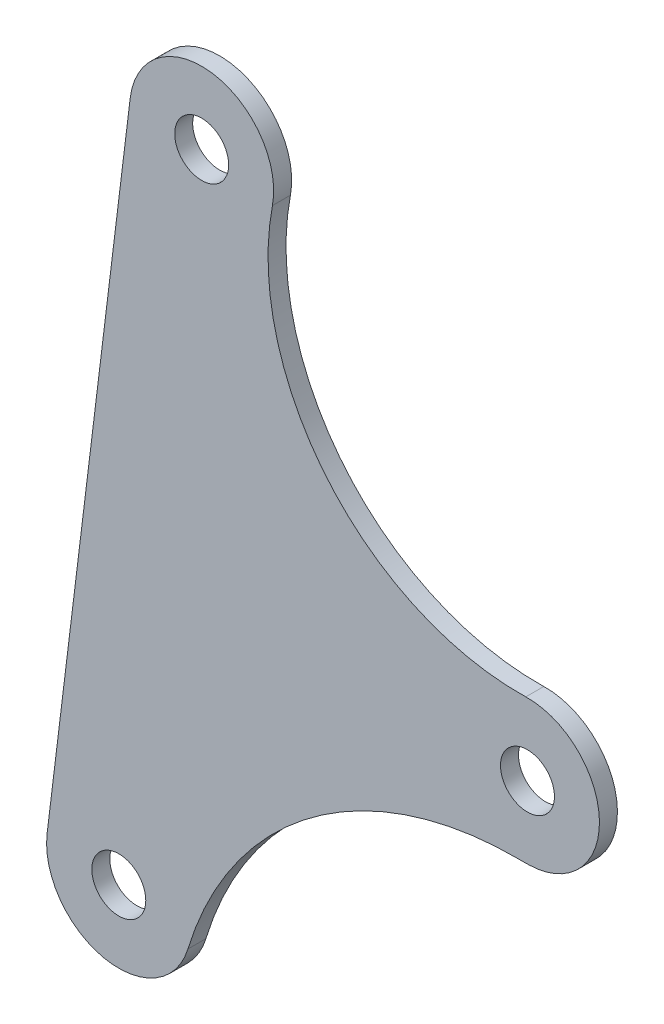
ISO-10303-21;
HEADER;
FILE_DESCRIPTION(('STEP AP214'),'2;1');
FILE_NAME('part.step','',(''),(''),'','','');
FILE_SCHEMA(('AUTOMOTIVE_DESIGN { 1 0 10303 214 1 1 1 1 }'));
ENDSEC;
DATA;
#1=APPLICATION_CONTEXT('core data for automotive mechanical design processes');
#2=APPLICATION_PROTOCOL_DEFINITION('international standard','automotive_design',2000,#1);
#3=PRODUCT_CONTEXT('',#1,'mechanical');
#4=PRODUCT('Part','Part','',(#3));
#5=PRODUCT_RELATED_PRODUCT_CATEGORY('part','',(#4));
#6=PRODUCT_DEFINITION_FORMATION('','',#4);
#7=PRODUCT_DEFINITION_CONTEXT('part definition',#1,'design');
#8=PRODUCT_DEFINITION('design','',#6,#7);
#9=PRODUCT_DEFINITION_SHAPE('','',#8);
#10=(LENGTH_UNIT() NAMED_UNIT(*) SI_UNIT(.MILLI.,.METRE.));
#11=(NAMED_UNIT(*) PLANE_ANGLE_UNIT() SI_UNIT($,.RADIAN.));
#12=(NAMED_UNIT(*) SI_UNIT($,.STERADIAN.) SOLID_ANGLE_UNIT());
#13=UNCERTAINTY_MEASURE_WITH_UNIT(LENGTH_MEASURE(1.E-05),#10,'distance_accuracy_value','');
#14=(GEOMETRIC_REPRESENTATION_CONTEXT(3) GLOBAL_UNCERTAINTY_ASSIGNED_CONTEXT((#13)) GLOBAL_UNIT_ASSIGNED_CONTEXT((#10,
#11,#12)) REPRESENTATION_CONTEXT('',''));
#15=CARTESIAN_POINT('',(0.,0.,0.));
#16=DIRECTION('',(0.,0.,1.));
#17=DIRECTION('',(1.,0.,0.));
#18=AXIS2_PLACEMENT_3D('',#15,#16,#17);
#19=CARTESIAN_POINT('',(-54.484155585902,-22.2361374727643,1.));
#20=DIRECTION('',(0.,0.,1.));
#21=DIRECTION('',(1.,0.,0.));
#22=AXIS2_PLACEMENT_3D('',#19,#20,#21);
#23=PLANE('',#22);
#24=CARTESIAN_POINT('',(-31.7651022120724,-5.87017847864853,1.));
#25=DIRECTION('',(0.,0.,1.));
#26=DIRECTION('',(1.,0.,0.));
#27=AXIS2_PLACEMENT_3D('',#24,#25,#26);
#28=CIRCLE('',#27,1.5);
#29=CARTESIAN_POINT('',(-30.2651022120724,-5.87017847864853,1.));
#30=VERTEX_POINT('',#29);
#31=EDGE_CURVE('E172',#30,#30,#28,.T.);
#32=ORIENTED_EDGE('',*,*,#31,.F.);
#33=EDGE_LOOP('',(#32));
#34=FACE_BOUND('',#33,.T.);
#35=CARTESIAN_POINT('',(-54.484155585902,-22.2361374727643,1.));
#36=DIRECTION('',(0.,0.,1.));
#37=DIRECTION('',(1.,0.,0.));
#38=AXIS2_PLACEMENT_3D('',#35,#36,#37);
#39=CIRCLE('',#38,4.01497337177752);
#40=CARTESIAN_POINT('',(-58.469338957959,-21.7479523980607,1.));
#41=VERTEX_POINT('',#40);
#42=CARTESIAN_POINT('',(-50.6422409886066,-23.4022006799581,1.));
#43=VERTEX_POINT('',#42);
#44=EDGE_CURVE('E145',#41,#43,#39,.T.);
#45=ORIENTED_EDGE('',*,*,#44,.T.);
#46=CARTESIAN_POINT('',(-32.4018945459792,-28.9383458322185,1.));
#47=DIRECTION('',(0.,0.,-1.));
#48=DIRECTION('',(1.,0.,0.));
#49=AXIS2_PLACEMENT_3D('',#46,#47,#48);
#50=CIRCLE('',#49,19.0619815731201);
#51=CARTESIAN_POINT('',(-32.2972897682896,-9.87665127652765,1.));
#52=VERTEX_POINT('',#51);
#53=EDGE_CURVE('E98',#43,#52,#50,.T.);
#54=ORIENTED_EDGE('',*,*,#53,.T.);
#55=CARTESIAN_POINT('',(-32.1764777449876,12.1384223912549,1.));
#56=DIRECTION('',(0.,0.,1.));
#57=DIRECTION('',(1.,0.,0.));
#58=AXIS2_PLACEMENT_3D('',#55,#56,#57);
#59=CIRCLE('',#58,22.0154051550924);
#60=CARTESIAN_POINT('',(-31.6737048154889,-9.87124102107902,1.));
#61=VERTEX_POINT('',#60);
#62=EDGE_CURVE('E157',#52,#61,#59,.T.);
#63=ORIENTED_EDGE('',*,*,#62,.T.);
#64=CARTESIAN_POINT('',(-31.7651022120724,-5.87017847864853,1.));
#65=DIRECTION('',(0.,0.,1.));
#66=DIRECTION('',(1.,0.,0.));
#67=AXIS2_PLACEMENT_3D('',#64,#65,#66);
#68=CIRCLE('',#67,4.00210631449771);
#69=CARTESIAN_POINT('',(-31.8564996086558,-1.86911593621805,1.));
#70=VERTEX_POINT('',#69);
#71=EDGE_CURVE('E114',#61,#70,#68,.T.);
#72=ORIENTED_EDGE('',*,*,#71,.T.);
#73=CARTESIAN_POINT('',(-32.1764777449876,12.1384223912549,1.));
#74=DIRECTION('',(0.,0.,-1.));
#75=DIRECTION('',(1.,0.,0.));
#76=AXIS2_PLACEMENT_3D('',#73,#74,#75);
#77=CIRCLE('',#76,14.011192526097);
#78=CARTESIAN_POINT('',(-45.9439688735725,14.7402878811856,1.));
#79=VERTEX_POINT('',#78);
#80=EDGE_CURVE('E108',#70,#79,#77,.T.);
#81=ORIENTED_EDGE('',*,*,#80,.T.);
#82=CARTESIAN_POINT('',(-49.8764652030516,15.4834753213218,1.));
#83=DIRECTION('',(0.,0.,1.));
#84=DIRECTION('',(1.,0.,0.));
#85=AXIS2_PLACEMENT_3D('',#82,#83,#84);
#86=CIRCLE('',#85,4.00210631449771);
#87=CARTESIAN_POINT('',(-53.8488769878598,15.9700958762298,1.));
#88=VERTEX_POINT('',#87);
#89=EDGE_CURVE('E112',#79,#88,#86,.T.);
#90=ORIENTED_EDGE('',*,*,#89,.T.);
#91=DIRECTION('',(-0.12159111144678,-0.992580274646407,0.));
#92=VECTOR('',#91,1.);
#93=CARTESIAN_POINT('',(-58.469338957959,-21.7479523980607,1.));
#94=LINE('',#93,#92);
#95=EDGE_CURVE('E58',#88,#41,#94,.T.);
#96=ORIENTED_EDGE('',*,*,#95,.T.);
#97=EDGE_LOOP('',(#45,#54,#63,#72,#81,#90,#96));
#98=FACE_BOUND('',#97,.T.);
#99=CARTESIAN_POINT('',(-54.484155585902,-22.2361374727643,1.));
#100=DIRECTION('',(0.,0.,1.));
#101=DIRECTION('',(1.,0.,0.));
#102=AXIS2_PLACEMENT_3D('',#99,#100,#101);
#103=CIRCLE('',#102,1.5);
#104=CARTESIAN_POINT('',(-52.984155585902,-22.2361374727643,1.));
#105=VERTEX_POINT('',#104);
#106=EDGE_CURVE('E136',#105,#105,#103,.T.);
#107=ORIENTED_EDGE('',*,*,#106,.F.);
#108=EDGE_LOOP('',(#107));
#109=FACE_BOUND('',#108,.T.);
#110=CARTESIAN_POINT('',(-49.8764652030516,15.4834753213218,1.));
#111=DIRECTION('',(0.,0.,1.));
#112=DIRECTION('',(1.,0.,0.));
#113=AXIS2_PLACEMENT_3D('',#110,#111,#112);
#114=CIRCLE('',#113,1.5);
#115=CARTESIAN_POINT('',(-48.3764652030516,15.4834753213218,1.));
#116=VERTEX_POINT('',#115);
#117=EDGE_CURVE('E178',#116,#116,#114,.T.);
#118=ORIENTED_EDGE('',*,*,#117,.F.);
#119=EDGE_LOOP('',(#118));
#120=FACE_BOUND('',#119,.T.);
#121=ADVANCED_FACE('F41',(#34,#98,#109,#120),#23,.T.);
#122=CARTESIAN_POINT('',(-54.484155585902,-22.2361374727643,0.));
#123=DIRECTION('',(0.,0.,1.));
#124=DIRECTION('',(1.,0.,0.));
#125=AXIS2_PLACEMENT_3D('',#122,#123,#124);
#126=PLANE('',#125);
#127=CARTESIAN_POINT('',(-54.484155585902,-22.2361374727643,0.));
#128=DIRECTION('',(0.,0.,1.));
#129=DIRECTION('',(1.,0.,0.));
#130=AXIS2_PLACEMENT_3D('',#127,#128,#129);
#131=CIRCLE('',#130,4.01497337177752);
#132=CARTESIAN_POINT('',(-58.469338957959,-21.7479523980607,0.));
#133=VERTEX_POINT('',#132);
#134=CARTESIAN_POINT('',(-50.6422409886066,-23.4022006799581,0.));
#135=VERTEX_POINT('',#134);
#136=EDGE_CURVE('E132',#133,#135,#131,.T.);
#137=ORIENTED_EDGE('',*,*,#136,.F.);
#138=DIRECTION('',(-0.12159111144678,-0.992580274646407,0.));
#139=VECTOR('',#138,1.);
#140=CARTESIAN_POINT('',(-58.469338957959,-21.7479523980607,0.));
#141=LINE('',#140,#139);
#142=CARTESIAN_POINT('',(-53.8488769878598,15.9700958762298,0.));
#143=VERTEX_POINT('',#142);
#144=EDGE_CURVE('E90',#143,#133,#141,.T.);
#145=ORIENTED_EDGE('',*,*,#144,.F.);
#146=CARTESIAN_POINT('',(-49.8764652030516,15.4834753213218,0.));
#147=DIRECTION('',(0.,0.,1.));
#148=DIRECTION('',(1.,0.,0.));
#149=AXIS2_PLACEMENT_3D('',#146,#147,#148);
#150=CIRCLE('',#149,4.00210631449771);
#151=CARTESIAN_POINT('',(-45.9439688735725,14.7402878811856,0.));
#152=VERTEX_POINT('',#151);
#153=EDGE_CURVE('E84',#152,#143,#150,.T.);
#154=ORIENTED_EDGE('',*,*,#153,.F.);
#155=CARTESIAN_POINT('',(-32.1764777449876,12.1384223912549,0.));
#156=DIRECTION('',(0.,0.,-1.));
#157=DIRECTION('',(1.,0.,0.));
#158=AXIS2_PLACEMENT_3D('',#155,#156,#157);
#159=CIRCLE('',#158,14.011192526097);
#160=CARTESIAN_POINT('',(-31.8564996086558,-1.86911593621805,0.));
#161=VERTEX_POINT('',#160);
#162=EDGE_CURVE('E122',#161,#152,#159,.T.);
#163=ORIENTED_EDGE('',*,*,#162,.F.);
#164=CARTESIAN_POINT('',(-31.7651022120724,-5.87017847864853,0.));
#165=DIRECTION('',(0.,0.,1.));
#166=DIRECTION('',(1.,0.,0.));
#167=AXIS2_PLACEMENT_3D('',#164,#165,#166);
#168=CIRCLE('',#167,4.00210631449771);
#169=CARTESIAN_POINT('',(-31.6737048154889,-9.87124102107902,0.));
#170=VERTEX_POINT('',#169);
#171=EDGE_CURVE('E140',#170,#161,#168,.T.);
#172=ORIENTED_EDGE('',*,*,#171,.F.);
#173=CARTESIAN_POINT('',(-32.1764777449876,12.1384223912549,0.));
#174=DIRECTION('',(0.,0.,1.));
#175=DIRECTION('',(1.,0.,0.));
#176=AXIS2_PLACEMENT_3D('',#173,#174,#175);
#177=CIRCLE('',#176,22.0154051550924);
#178=CARTESIAN_POINT('',(-32.2972897682896,-9.87665127652765,0.));
#179=VERTEX_POINT('',#178);
#180=EDGE_CURVE('E138',#179,#170,#177,.T.);
#181=ORIENTED_EDGE('',*,*,#180,.F.);
#182=CARTESIAN_POINT('',(-32.4018945459792,-28.9383458322185,0.));
#183=DIRECTION('',(0.,0.,-1.));
#184=DIRECTION('',(1.,0.,0.));
#185=AXIS2_PLACEMENT_3D('',#182,#183,#184);
#186=CIRCLE('',#185,19.0619815731201);
#187=EDGE_CURVE('E135',#135,#179,#186,.T.);
#188=ORIENTED_EDGE('',*,*,#187,.F.);
#189=EDGE_LOOP('',(#137,#145,#154,#163,#172,#181,#188));
#190=FACE_BOUND('',#189,.T.);
#191=CARTESIAN_POINT('',(-54.484155585902,-22.2361374727643,0.));
#192=DIRECTION('',(0.,0.,1.));
#193=DIRECTION('',(1.,0.,0.));
#194=AXIS2_PLACEMENT_3D('',#191,#192,#193);
#195=CIRCLE('',#194,1.5);
#196=CARTESIAN_POINT('',(-52.984155585902,-22.2361374727643,0.));
#197=VERTEX_POINT('',#196);
#198=EDGE_CURVE('E169',#197,#197,#195,.T.);
#199=ORIENTED_EDGE('',*,*,#198,.T.);
#200=EDGE_LOOP('',(#199));
#201=FACE_BOUND('',#200,.T.);
#202=CARTESIAN_POINT('',(-31.7651022120724,-5.87017847864853,0.));
#203=DIRECTION('',(0.,0.,1.));
#204=DIRECTION('',(1.,0.,0.));
#205=AXIS2_PLACEMENT_3D('',#202,#203,#204);
#206=CIRCLE('',#205,1.5);
#207=CARTESIAN_POINT('',(-30.2651022120724,-5.87017847864853,0.));
#208=VERTEX_POINT('',#207);
#209=EDGE_CURVE('E175',#208,#208,#206,.T.);
#210=ORIENTED_EDGE('',*,*,#209,.T.);
#211=EDGE_LOOP('',(#210));
#212=FACE_BOUND('',#211,.T.);
#213=CARTESIAN_POINT('',(-49.8764652030516,15.4834753213218,0.));
#214=DIRECTION('',(0.,0.,1.));
#215=DIRECTION('',(1.,0.,0.));
#216=AXIS2_PLACEMENT_3D('',#213,#214,#215);
#217=CIRCLE('',#216,1.5);
#218=CARTESIAN_POINT('',(-48.3764652030516,15.4834753213218,0.));
#219=VERTEX_POINT('',#218);
#220=EDGE_CURVE('E181',#219,#219,#217,.T.);
#221=ORIENTED_EDGE('',*,*,#220,.T.);
#222=EDGE_LOOP('',(#221));
#223=FACE_BOUND('',#222,.T.);
#224=ADVANCED_FACE('F161',(#190,#201,#212,#223),#126,.F.);
#225=CARTESIAN_POINT('',(-54.484155585902,-22.2361374727643,1.));
#226=DIRECTION('',(0.,0.,-1.));
#227=DIRECTION('',(-1.,0.,0.));
#228=AXIS2_PLACEMENT_3D('',#225,#226,#227);
#229=CYLINDRICAL_SURFACE('',#228,4.01497337177752);
#230=ORIENTED_EDGE('',*,*,#136,.T.);
#231=DIRECTION('',(0.,0.,-1.));
#232=VECTOR('',#231,1.);
#233=CARTESIAN_POINT('',(-50.6422409886066,-23.4022006799581,1.));
#234=LINE('',#233,#232);
#235=EDGE_CURVE('E11',#43,#135,#234,.T.);
#236=ORIENTED_EDGE('',*,*,#235,.F.);
#237=ORIENTED_EDGE('',*,*,#44,.F.);
#238=DIRECTION('',(0.,0.,-1.));
#239=VECTOR('',#238,1.);
#240=CARTESIAN_POINT('',(-58.469338957959,-21.7479523980607,1.));
#241=LINE('',#240,#239);
#242=EDGE_CURVE('E128',#41,#133,#241,.T.);
#243=ORIENTED_EDGE('',*,*,#242,.T.);
#244=EDGE_LOOP('',(#230,#236,#237,#243));
#245=FACE_BOUND('',#244,.T.);
#246=ADVANCED_FACE('F43',(#245),#229,.T.);
#247=CARTESIAN_POINT('',(-32.4018945459792,-28.9383458322185,1.));
#248=DIRECTION('',(0.,0.,-1.));
#249=DIRECTION('',(-1.,0.,0.));
#250=AXIS2_PLACEMENT_3D('',#247,#248,#249);
#251=CYLINDRICAL_SURFACE('',#250,19.0619815731201);
#252=ORIENTED_EDGE('',*,*,#187,.T.);
#253=DIRECTION('',(0.,0.,-1.));
#254=VECTOR('',#253,1.);
#255=CARTESIAN_POINT('',(-32.2972897682896,-9.87665127652765,1.));
#256=LINE('',#255,#254);
#257=EDGE_CURVE('E50',#52,#179,#256,.T.);
#258=ORIENTED_EDGE('',*,*,#257,.F.);
#259=ORIENTED_EDGE('',*,*,#53,.F.);
#260=ORIENTED_EDGE('',*,*,#235,.T.);
#261=EDGE_LOOP('',(#252,#258,#259,#260));
#262=FACE_BOUND('',#261,.T.);
#263=ADVANCED_FACE('F212',(#262),#251,.F.);
#264=CARTESIAN_POINT('',(-32.1764777449876,12.1384223912549,1.));
#265=DIRECTION('',(0.,0.,-1.));
#266=DIRECTION('',(-1.,0.,0.));
#267=AXIS2_PLACEMENT_3D('',#264,#265,#266);
#268=CYLINDRICAL_SURFACE('',#267,22.0154051550924);
#269=ORIENTED_EDGE('',*,*,#180,.T.);
#270=DIRECTION('',(0.,0.,-1.));
#271=VECTOR('',#270,1.);
#272=CARTESIAN_POINT('',(-31.6737048154889,-9.87124102107902,1.));
#273=LINE('',#272,#271);
#274=EDGE_CURVE('E149',#61,#170,#273,.T.);
#275=ORIENTED_EDGE('',*,*,#274,.F.);
#276=ORIENTED_EDGE('',*,*,#62,.F.);
#277=ORIENTED_EDGE('',*,*,#257,.T.);
#278=EDGE_LOOP('',(#269,#275,#276,#277));
#279=FACE_BOUND('',#278,.T.);
#280=ADVANCED_FACE('F155',(#279),#268,.T.);
#281=CARTESIAN_POINT('',(-31.7651022120724,-5.87017847864853,1.));
#282=DIRECTION('',(0.,0.,-1.));
#283=DIRECTION('',(-1.,0.,0.));
#284=AXIS2_PLACEMENT_3D('',#281,#282,#283);
#285=CYLINDRICAL_SURFACE('',#284,4.00210631449771);
#286=ORIENTED_EDGE('',*,*,#171,.T.);
#287=DIRECTION('',(0.,0.,-1.));
#288=VECTOR('',#287,1.);
#289=CARTESIAN_POINT('',(-31.8564996086558,-1.86911593621805,1.));
#290=LINE('',#289,#288);
#291=EDGE_CURVE('E123',#70,#161,#290,.T.);
#292=ORIENTED_EDGE('',*,*,#291,.F.);
#293=ORIENTED_EDGE('',*,*,#71,.F.);
#294=ORIENTED_EDGE('',*,*,#274,.T.);
#295=EDGE_LOOP('',(#286,#292,#293,#294));
#296=FACE_BOUND('',#295,.T.);
#297=ADVANCED_FACE('F164',(#296),#285,.T.);
#298=CARTESIAN_POINT('',(-32.1764777449876,12.1384223912549,1.));
#299=DIRECTION('',(0.,0.,-1.));
#300=DIRECTION('',(-1.,0.,0.));
#301=AXIS2_PLACEMENT_3D('',#298,#299,#300);
#302=CYLINDRICAL_SURFACE('',#301,14.011192526097);
#303=ORIENTED_EDGE('',*,*,#162,.T.);
#304=DIRECTION('',(0.,0.,-1.));
#305=VECTOR('',#304,1.);
#306=CARTESIAN_POINT('',(-45.9439688735725,14.7402878811856,1.));
#307=LINE('',#306,#305);
#308=EDGE_CURVE('E119',#79,#152,#307,.T.);
#309=ORIENTED_EDGE('',*,*,#308,.F.);
#310=ORIENTED_EDGE('',*,*,#80,.F.);
#311=ORIENTED_EDGE('',*,*,#291,.T.);
#312=EDGE_LOOP('',(#303,#309,#310,#311));
#313=FACE_BOUND('',#312,.T.);
#314=ADVANCED_FACE('F120',(#313),#302,.F.);
#315=CARTESIAN_POINT('',(-49.8764652030516,15.4834753213218,1.));
#316=DIRECTION('',(0.,0.,-1.));
#317=DIRECTION('',(-1.,0.,0.));
#318=AXIS2_PLACEMENT_3D('',#315,#316,#317);
#319=CYLINDRICAL_SURFACE('',#318,4.00210631449771);
#320=ORIENTED_EDGE('',*,*,#153,.T.);
#321=DIRECTION('',(0.,0.,-1.));
#322=VECTOR('',#321,1.);
#323=CARTESIAN_POINT('',(-53.8488769878598,15.9700958762298,1.));
#324=LINE('',#323,#322);
#325=EDGE_CURVE('E124',#88,#143,#324,.T.);
#326=ORIENTED_EDGE('',*,*,#325,.F.);
#327=ORIENTED_EDGE('',*,*,#89,.F.);
#328=ORIENTED_EDGE('',*,*,#308,.T.);
#329=EDGE_LOOP('',(#320,#326,#327,#328));
#330=FACE_BOUND('',#329,.T.);
#331=ADVANCED_FACE('F126',(#330),#319,.T.);
#332=CARTESIAN_POINT('',(-58.469338957959,-21.7479523980607,1.));
#333=DIRECTION('',(0.992580274646407,-0.12159111144678,0.));
#334=DIRECTION('',(0.12159111144678,0.992580274646407,0.));
#335=AXIS2_PLACEMENT_3D('',#332,#333,#334);
#336=PLANE('',#335);
#337=ORIENTED_EDGE('',*,*,#144,.T.);
#338=ORIENTED_EDGE('',*,*,#242,.F.);
#339=ORIENTED_EDGE('',*,*,#95,.F.);
#340=ORIENTED_EDGE('',*,*,#325,.T.);
#341=EDGE_LOOP('',(#337,#338,#339,#340));
#342=FACE_BOUND('',#341,.T.);
#343=ADVANCED_FACE('F202',(#342),#336,.F.);
#344=CARTESIAN_POINT('',(-54.484155585902,-22.2361374727643,1.));
#345=DIRECTION('',(0.,0.,-1.));
#346=DIRECTION('',(-1.,0.,0.));
#347=AXIS2_PLACEMENT_3D('',#344,#345,#346);
#348=CYLINDRICAL_SURFACE('',#347,1.5);
#349=ORIENTED_EDGE('',*,*,#106,.T.);
#350=EDGE_LOOP('',(#349));
#351=FACE_BOUND('',#350,.T.);
#352=ORIENTED_EDGE('',*,*,#198,.F.);
#353=EDGE_LOOP('',(#352));
#354=FACE_BOUND('',#353,.T.);
#355=ADVANCED_FACE('F199',(#351,#354),#348,.F.);
#356=CARTESIAN_POINT('',(-31.7651022120724,-5.87017847864853,1.));
#357=DIRECTION('',(0.,0.,-1.));
#358=DIRECTION('',(-1.,0.,0.));
#359=AXIS2_PLACEMENT_3D('',#356,#357,#358);
#360=CYLINDRICAL_SURFACE('',#359,1.5);
#361=ORIENTED_EDGE('',*,*,#31,.T.);
#362=EDGE_LOOP('',(#361));
#363=FACE_BOUND('',#362,.T.);
#364=ORIENTED_EDGE('',*,*,#209,.F.);
#365=EDGE_LOOP('',(#364));
#366=FACE_BOUND('',#365,.T.);
#367=ADVANCED_FACE('F301',(#363,#366),#360,.F.);
#368=CARTESIAN_POINT('',(-49.8764652030516,15.4834753213218,1.));
#369=DIRECTION('',(0.,0.,-1.));
#370=DIRECTION('',(-1.,0.,0.));
#371=AXIS2_PLACEMENT_3D('',#368,#369,#370);
#372=CYLINDRICAL_SURFACE('',#371,1.5);
#373=ORIENTED_EDGE('',*,*,#117,.T.);
#374=EDGE_LOOP('',(#373));
#375=FACE_BOUND('',#374,.T.);
#376=ORIENTED_EDGE('',*,*,#220,.F.);
#377=EDGE_LOOP('',(#376));
#378=FACE_BOUND('',#377,.T.);
#379=ADVANCED_FACE('F187',(#375,#378),#372,.F.);
#380=CLOSED_SHELL('',(#121,#224,#246,#263,#280,#297,#314,#331,#343,#355,#367,#379));
#381=MANIFOLD_SOLID_BREP('B2',#380);
#382=ADVANCED_BREP_SHAPE_REPRESENTATION('',(#18,#381),#14);
#383=SHAPE_DEFINITION_REPRESENTATION(#9,#382);
ENDSEC;
END-ISO-10303-21;
